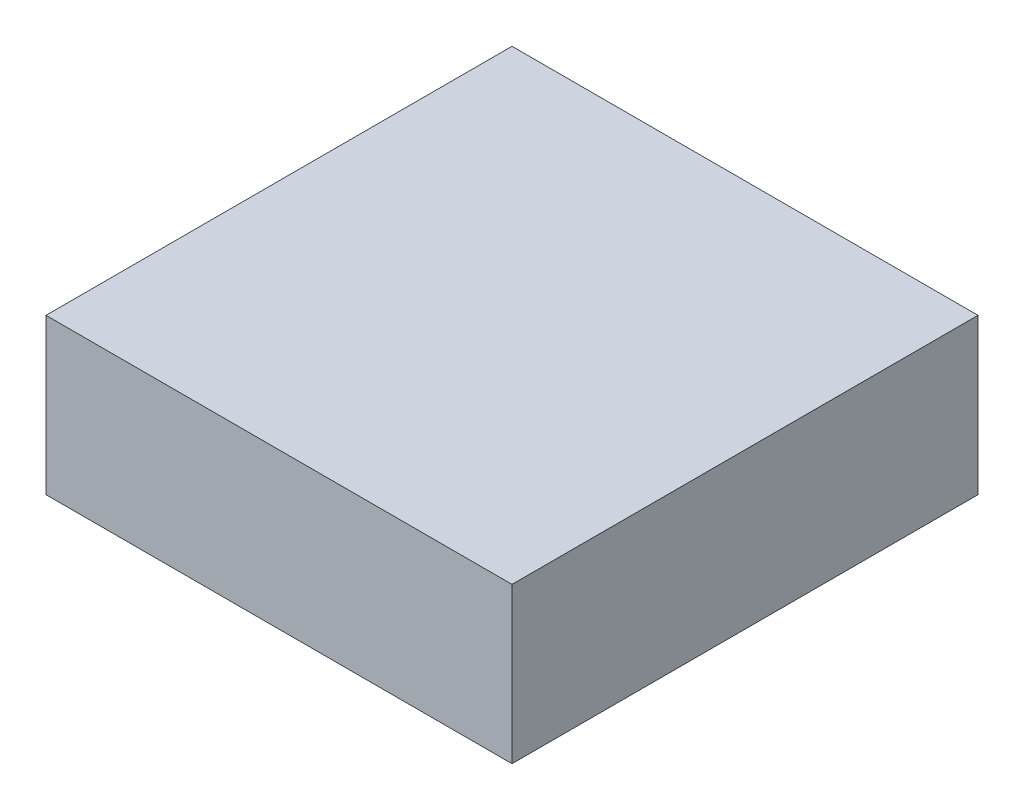
ISO-10303-21;
HEADER;
FILE_DESCRIPTION(('STEP AP214'),'2;1');
FILE_NAME('part.step','',(''),(''),'','','');
FILE_SCHEMA(('AUTOMOTIVE_DESIGN { 1 0 10303 214 1 1 1 1 }'));
ENDSEC;
DATA;
#1=APPLICATION_CONTEXT('core data for automotive mechanical design processes');
#2=APPLICATION_PROTOCOL_DEFINITION('international standard','automotive_design',2000,#1);
#3=PRODUCT_CONTEXT('',#1,'mechanical');
#4=PRODUCT('Part','Part','',(#3));
#5=PRODUCT_RELATED_PRODUCT_CATEGORY('part','',(#4));
#6=PRODUCT_DEFINITION_FORMATION('','',#4);
#7=PRODUCT_DEFINITION_CONTEXT('part definition',#1,'design');
#8=PRODUCT_DEFINITION('design','',#6,#7);
#9=PRODUCT_DEFINITION_SHAPE('','',#8);
#10=(LENGTH_UNIT() NAMED_UNIT(*) SI_UNIT(.MILLI.,.METRE.));
#11=(NAMED_UNIT(*) PLANE_ANGLE_UNIT() SI_UNIT($,.RADIAN.));
#12=(NAMED_UNIT(*) SI_UNIT($,.STERADIAN.) SOLID_ANGLE_UNIT());
#13=UNCERTAINTY_MEASURE_WITH_UNIT(LENGTH_MEASURE(1.E-05),#10,'distance_accuracy_value','');
#14=(GEOMETRIC_REPRESENTATION_CONTEXT(3) GLOBAL_UNCERTAINTY_ASSIGNED_CONTEXT((#13)) GLOBAL_UNIT_ASSIGNED_CONTEXT((#10,
#11,#12)) REPRESENTATION_CONTEXT('',''));
#15=CARTESIAN_POINT('',(0.,0.,0.));
#16=DIRECTION('',(0.,0.,1.));
#17=DIRECTION('',(1.,0.,0.));
#18=AXIS2_PLACEMENT_3D('',#15,#16,#17);
#19=CARTESIAN_POINT('',(0.,50.,0.));
#20=DIRECTION('',(0.,0.,-1.));
#21=DIRECTION('',(-1.,0.,0.));
#22=AXIS2_PLACEMENT_3D('',#19,#20,#21);
#23=PLANE('',#22);
#24=DIRECTION('',(1.,0.,0.));
#25=VECTOR('',#24,1.);
#26=CARTESIAN_POINT('',(0.,0.,0.));
#27=LINE('',#26,#25);
#28=CARTESIAN_POINT('',(0.,0.,0.));
#29=VERTEX_POINT('',#28);
#30=CARTESIAN_POINT('',(150.,0.,0.));
#31=VERTEX_POINT('',#30);
#32=EDGE_CURVE('E96',#29,#31,#27,.T.);
#33=ORIENTED_EDGE('',*,*,#32,.T.);
#34=DIRECTION('',(0.,-1.,0.));
#35=VECTOR('',#34,1.);
#36=CARTESIAN_POINT('',(150.,50.,0.));
#37=LINE('',#36,#35);
#38=CARTESIAN_POINT('',(150.,50.,0.));
#39=VERTEX_POINT('',#38);
#40=EDGE_CURVE('E11',#39,#31,#37,.T.);
#41=ORIENTED_EDGE('',*,*,#40,.F.);
#42=DIRECTION('',(1.,0.,0.));
#43=VECTOR('',#42,1.);
#44=CARTESIAN_POINT('',(0.,50.,0.));
#45=LINE('',#44,#43);
#46=CARTESIAN_POINT('',(0.,50.,0.));
#47=VERTEX_POINT('',#46);
#48=EDGE_CURVE('E82',#47,#39,#45,.T.);
#49=ORIENTED_EDGE('',*,*,#48,.F.);
#50=DIRECTION('',(0.,-1.,0.));
#51=VECTOR('',#50,1.);
#52=CARTESIAN_POINT('',(0.,50.,0.));
#53=LINE('',#52,#51);
#54=EDGE_CURVE('E49',#47,#29,#53,.T.);
#55=ORIENTED_EDGE('',*,*,#54,.T.);
#56=EDGE_LOOP('',(#33,#41,#49,#55));
#57=FACE_BOUND('',#56,.T.);
#58=ADVANCED_FACE('F33',(#57),#23,.F.);
#59=CARTESIAN_POINT('',(150.,50.,0.));
#60=DIRECTION('',(-1.,0.,0.));
#61=DIRECTION('',(0.,0.,1.));
#62=AXIS2_PLACEMENT_3D('',#59,#60,#61);
#63=PLANE('',#62);
#64=DIRECTION('',(0.,0.,-1.));
#65=VECTOR('',#64,1.);
#66=CARTESIAN_POINT('',(150.,0.,0.));
#67=LINE('',#66,#65);
#68=CARTESIAN_POINT('',(150.,0.,-150.));
#69=VERTEX_POINT('',#68);
#70=EDGE_CURVE('E87',#31,#69,#67,.T.);
#71=ORIENTED_EDGE('',*,*,#70,.T.);
#72=DIRECTION('',(0.,-1.,0.));
#73=VECTOR('',#72,1.);
#74=CARTESIAN_POINT('',(150.,50.,-150.));
#75=LINE('',#74,#73);
#76=CARTESIAN_POINT('',(150.,50.,-150.));
#77=VERTEX_POINT('',#76);
#78=EDGE_CURVE('E41',#77,#69,#75,.T.);
#79=ORIENTED_EDGE('',*,*,#78,.F.);
#80=DIRECTION('',(0.,0.,-1.));
#81=VECTOR('',#80,1.);
#82=CARTESIAN_POINT('',(150.,50.,0.));
#83=LINE('',#82,#81);
#84=EDGE_CURVE('E74',#39,#77,#83,.T.);
#85=ORIENTED_EDGE('',*,*,#84,.F.);
#86=ORIENTED_EDGE('',*,*,#40,.T.);
#87=EDGE_LOOP('',(#71,#79,#85,#86));
#88=FACE_BOUND('',#87,.T.);
#89=ADVANCED_FACE('F86',(#88),#63,.F.);
#90=CARTESIAN_POINT('',(0.,50.,-150.));
#91=DIRECTION('',(0.,0.,-1.));
#92=DIRECTION('',(-1.,0.,0.));
#93=AXIS2_PLACEMENT_3D('',#90,#91,#92);
#94=PLANE('',#93);
#95=DIRECTION('',(1.,0.,0.));
#96=VECTOR('',#95,1.);
#97=CARTESIAN_POINT('',(0.,0.,-150.));
#98=LINE('',#97,#96);
#99=CARTESIAN_POINT('',(0.,0.,-150.));
#100=VERTEX_POINT('',#99);
#101=EDGE_CURVE('E99',#100,#69,#98,.T.);
#102=ORIENTED_EDGE('',*,*,#101,.F.);
#103=DIRECTION('',(0.,-1.,0.));
#104=VECTOR('',#103,1.);
#105=CARTESIAN_POINT('',(0.,50.,-150.));
#106=LINE('',#105,#104);
#107=CARTESIAN_POINT('',(0.,50.,-150.));
#108=VERTEX_POINT('',#107);
#109=EDGE_CURVE('E63',#108,#100,#106,.T.);
#110=ORIENTED_EDGE('',*,*,#109,.F.);
#111=DIRECTION('',(1.,0.,0.));
#112=VECTOR('',#111,1.);
#113=CARTESIAN_POINT('',(0.,50.,-150.));
#114=LINE('',#113,#112);
#115=EDGE_CURVE('E81',#108,#77,#114,.T.);
#116=ORIENTED_EDGE('',*,*,#115,.T.);
#117=ORIENTED_EDGE('',*,*,#78,.T.);
#118=EDGE_LOOP('',(#102,#110,#116,#117));
#119=FACE_BOUND('',#118,.T.);
#120=ADVANCED_FACE('F90',(#119),#94,.T.);
#121=CARTESIAN_POINT('',(0.,50.,0.));
#122=DIRECTION('',(-1.,0.,0.));
#123=DIRECTION('',(0.,0.,1.));
#124=AXIS2_PLACEMENT_3D('',#121,#122,#123);
#125=PLANE('',#124);
#126=DIRECTION('',(0.,0.,-1.));
#127=VECTOR('',#126,1.);
#128=CARTESIAN_POINT('',(0.,0.,0.));
#129=LINE('',#128,#127);
#130=EDGE_CURVE('E101',#29,#100,#129,.T.);
#131=ORIENTED_EDGE('',*,*,#130,.F.);
#132=ORIENTED_EDGE('',*,*,#54,.F.);
#133=DIRECTION('',(0.,0.,-1.));
#134=VECTOR('',#133,1.);
#135=CARTESIAN_POINT('',(0.,50.,0.));
#136=LINE('',#135,#134);
#137=EDGE_CURVE('E91',#47,#108,#136,.T.);
#138=ORIENTED_EDGE('',*,*,#137,.T.);
#139=ORIENTED_EDGE('',*,*,#109,.T.);
#140=EDGE_LOOP('',(#131,#132,#138,#139));
#141=FACE_BOUND('',#140,.T.);
#142=ADVANCED_FACE('F107',(#141),#125,.T.);
#143=CARTESIAN_POINT('',(0.,50.,0.));
#144=DIRECTION('',(0.,1.,0.));
#145=DIRECTION('',(0.,0.,1.));
#146=AXIS2_PLACEMENT_3D('',#143,#144,#145);
#147=PLANE('',#146);
#148=ORIENTED_EDGE('',*,*,#48,.T.);
#149=ORIENTED_EDGE('',*,*,#84,.T.);
#150=ORIENTED_EDGE('',*,*,#115,.F.);
#151=ORIENTED_EDGE('',*,*,#137,.F.);
#152=EDGE_LOOP('',(#148,#149,#150,#151));
#153=FACE_BOUND('',#152,.T.);
#154=ADVANCED_FACE('F78',(#153),#147,.T.);
#155=CARTESIAN_POINT('',(0.,0.,0.));
#156=DIRECTION('',(0.,1.,0.));
#157=DIRECTION('',(0.,0.,1.));
#158=AXIS2_PLACEMENT_3D('',#155,#156,#157);
#159=PLANE('',#158);
#160=ORIENTED_EDGE('',*,*,#32,.F.);
#161=ORIENTED_EDGE('',*,*,#130,.T.);
#162=ORIENTED_EDGE('',*,*,#101,.T.);
#163=ORIENTED_EDGE('',*,*,#70,.F.);
#164=EDGE_LOOP('',(#160,#161,#162,#163));
#165=FACE_BOUND('',#164,.T.);
#166=ADVANCED_FACE('F106',(#165),#159,.F.);
#167=CLOSED_SHELL('',(#58,#89,#120,#142,#154,#166));
#168=MANIFOLD_SOLID_BREP('B2',#167);
#169=ADVANCED_BREP_SHAPE_REPRESENTATION('',(#18,#168),#14);
#170=SHAPE_DEFINITION_REPRESENTATION(#9,#169);
ENDSEC;
END-ISO-10303-21;
